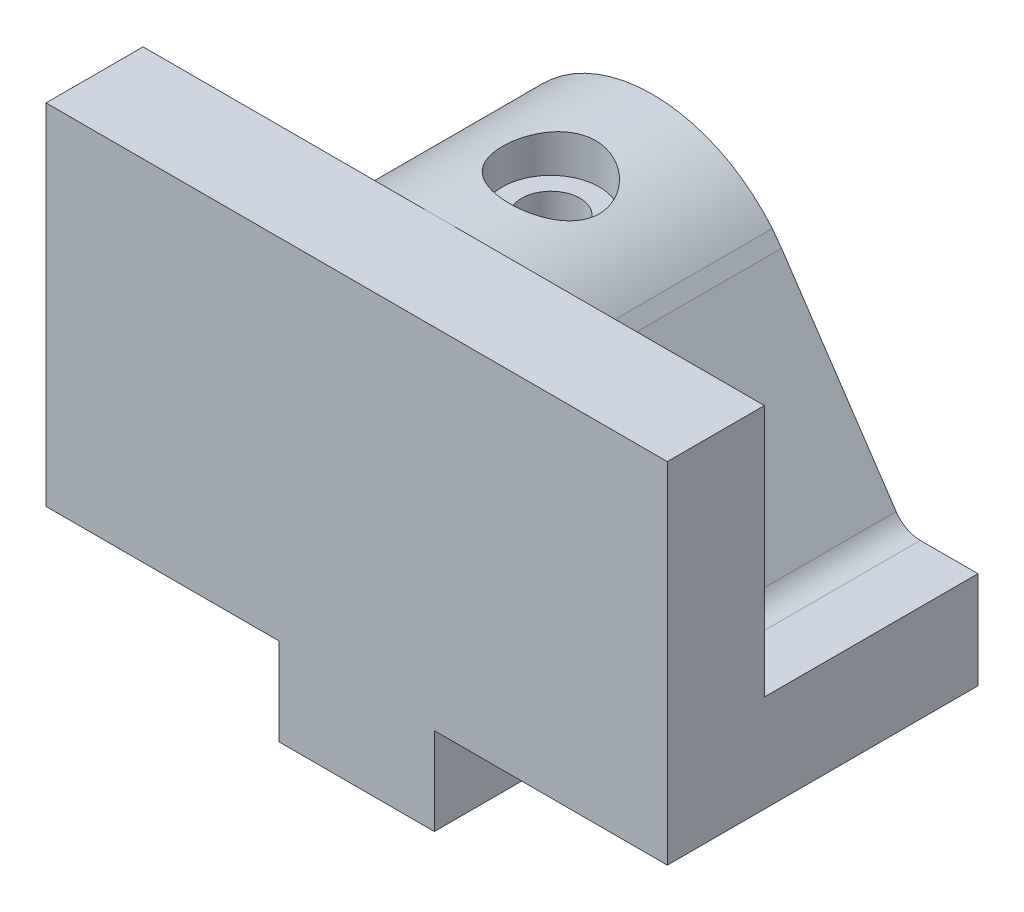
ISO-10303-21;
HEADER;
FILE_DESCRIPTION(('STEP AP214'),'2;1');
FILE_NAME('part.step','',(''),(''),'','','');
FILE_SCHEMA(('AUTOMOTIVE_DESIGN { 1 0 10303 214 1 1 1 1 }'));
ENDSEC;
DATA;
#1=APPLICATION_CONTEXT('core data for automotive mechanical design processes');
#2=APPLICATION_PROTOCOL_DEFINITION('international standard','automotive_design',2000,#1);
#3=PRODUCT_CONTEXT('',#1,'mechanical');
#4=PRODUCT('Part','Part','',(#3));
#5=PRODUCT_RELATED_PRODUCT_CATEGORY('part','',(#4));
#6=PRODUCT_DEFINITION_FORMATION('','',#4);
#7=PRODUCT_DEFINITION_CONTEXT('part definition',#1,'design');
#8=PRODUCT_DEFINITION('design','',#6,#7);
#9=PRODUCT_DEFINITION_SHAPE('','',#8);
#10=(LENGTH_UNIT() NAMED_UNIT(*) SI_UNIT(.MILLI.,.METRE.));
#11=(NAMED_UNIT(*) PLANE_ANGLE_UNIT() SI_UNIT($,.RADIAN.));
#12=(NAMED_UNIT(*) SI_UNIT($,.STERADIAN.) SOLID_ANGLE_UNIT());
#13=UNCERTAINTY_MEASURE_WITH_UNIT(LENGTH_MEASURE(1.E-05),#10,'distance_accuracy_value','');
#14=(GEOMETRIC_REPRESENTATION_CONTEXT(3) GLOBAL_UNCERTAINTY_ASSIGNED_CONTEXT((#13)) GLOBAL_UNIT_ASSIGNED_CONTEXT((#10,
#11,#12)) REPRESENTATION_CONTEXT('',''));
#15=CARTESIAN_POINT('',(0.,0.,0.));
#16=DIRECTION('',(0.,0.,1.));
#17=DIRECTION('',(1.,0.,0.));
#18=AXIS2_PLACEMENT_3D('',#15,#16,#17);
#19=CARTESIAN_POINT('',(33.5206158656522,-20.,11.));
#20=DIRECTION('',(0.,1.,0.));
#21=DIRECTION('',(-1.,0.,0.));
#22=AXIS2_PLACEMENT_3D('',#19,#20,#21);
#23=PLANE('',#22);
#24=DIRECTION('',(0.,0.,-1.));
#25=VECTOR('',#24,1.);
#26=CARTESIAN_POINT('',(-6.47938413434775,-20.,39.3575597506858));
#27=LINE('',#26,#25);
#28=CARTESIAN_POINT('',(-6.47938413434776,-20.,21.));
#29=VERTEX_POINT('',#28);
#30=CARTESIAN_POINT('',(-6.47938413434775,-20.,-11.));
#31=VERTEX_POINT('',#30);
#32=EDGE_CURVE('E68',#29,#31,#27,.T.);
#33=ORIENTED_EDGE('',*,*,#32,.F.);
#34=DIRECTION('',(1.,0.,0.));
#35=VECTOR('',#34,1.);
#36=CARTESIAN_POINT('',(-30.4793841343478,-20.,21.));
#37=LINE('',#36,#35);
#38=CARTESIAN_POINT('',(-30.4793841343478,-20.,21.));
#39=VERTEX_POINT('',#38);
#40=EDGE_CURVE('E272',#39,#29,#37,.T.);
#41=ORIENTED_EDGE('',*,*,#40,.F.);
#42=DIRECTION('',(0.,0.,-1.));
#43=VECTOR('',#42,1.);
#44=CARTESIAN_POINT('',(-30.4793841343478,-20.,11.));
#45=LINE('',#44,#43);
#46=CARTESIAN_POINT('',(-30.4793841343478,-20.,-11.));
#47=VERTEX_POINT('',#46);
#48=EDGE_CURVE('E53',#39,#47,#45,.T.);
#49=ORIENTED_EDGE('',*,*,#48,.T.);
#50=DIRECTION('',(1.,0.,0.));
#51=VECTOR('',#50,1.);
#52=CARTESIAN_POINT('',(33.5206158656522,-20.,-11.));
#53=LINE('',#52,#51);
#54=EDGE_CURVE('E216',#47,#31,#53,.T.);
#55=ORIENTED_EDGE('',*,*,#54,.T.);
#56=EDGE_LOOP('',(#33,#41,#49,#55));
#57=FACE_BOUND('',#56,.T.);
#58=ADVANCED_FACE('F41',(#57),#23,.F.);
#59=CARTESIAN_POINT('',(27.5790762015216,-7.,-11.));
#60=DIRECTION('',(0.,0.,1.));
#61=DIRECTION('',(1.,0.,0.));
#62=AXIS2_PLACEMENT_3D('',#59,#60,#61);
#63=PLANE('',#62);
#64=DIRECTION('',(0.,-1.,0.));
#65=VECTOR('',#64,1.);
#66=CARTESIAN_POINT('',(-30.4793841343478,-10.,-11.));
#67=LINE('',#66,#65);
#68=CARTESIAN_POINT('',(-30.4793841343478,-10.,-11.));
#69=VERTEX_POINT('',#68);
#70=EDGE_CURVE('E207',#69,#47,#67,.T.);
#71=ORIENTED_EDGE('',*,*,#70,.F.);
#72=DIRECTION('',(-1.,0.,0.));
#73=VECTOR('',#72,1.);
#74=CARTESIAN_POINT('',(-30.4793841343478,-10.,-11.));
#75=LINE('',#74,#73);
#76=CARTESIAN_POINT('',(-27.5790762015216,-10.,-11.));
#77=VERTEX_POINT('',#76);
#78=EDGE_CURVE('E242',#77,#69,#75,.T.);
#79=ORIENTED_EDGE('',*,*,#78,.F.);
#80=CARTESIAN_POINT('',(-27.5790762015216,-7.,-11.));
#81=DIRECTION('',(0.,0.,-1.));
#82=DIRECTION('',(-1.,0.,0.));
#83=AXIS2_PLACEMENT_3D('',#80,#81,#82);
#84=CIRCLE('',#83,3.);
#85=CARTESIAN_POINT('',(-25.0879938790146,-8.67167845666944,-11.));
#86=VERTEX_POINT('',#85);
#87=EDGE_CURVE('E240',#86,#77,#84,.T.);
#88=ORIENTED_EDGE('',*,*,#87,.F.);
#89=DIRECTION('',(-0.55722615222315,-0.830360774169025,0.));
#90=VECTOR('',#89,1.);
#91=CARTESIAN_POINT('',(-25.0879938790146,-8.67167845666944,-11.));
#92=LINE('',#91,#90);
#93=CARTESIAN_POINT('',(-13.2857723867044,8.9156184355704,-11.));
#94=VERTEX_POINT('',#93);
#95=EDGE_CURVE('E238',#94,#86,#92,.T.);
#96=ORIENTED_EDGE('',*,*,#95,.F.);
#97=CARTESIAN_POINT('',(0.,0.,-11.));
#98=DIRECTION('',(0.,0.,1.));
#99=DIRECTION('',(1.,0.,0.));
#100=AXIS2_PLACEMENT_3D('',#97,#98,#99);
#101=CIRCLE('',#100,16.);
#102=CARTESIAN_POINT('',(12.3334541959828,10.1924436518234,-11.));
#103=VERTEX_POINT('',#102);
#104=EDGE_CURVE('E236',#103,#94,#101,.T.);
#105=ORIENTED_EDGE('',*,*,#104,.F.);
#106=DIRECTION('',(-0.597868076572457,0.801594512840221,0.));
#107=VECTOR('',#106,1.);
#108=CARTESIAN_POINT('',(12.3334541959828,10.1924436518234,-11.));
#109=LINE('',#108,#107);
#110=CARTESIAN_POINT('',(13.2857723867044,8.9156184355704,-11.));
#111=VERTEX_POINT('',#110);
#112=EDGE_CURVE('E234',#111,#103,#109,.T.);
#113=ORIENTED_EDGE('',*,*,#112,.F.);
#114=DIRECTION('',(-0.55722615222315,0.830360774169025,0.));
#115=VECTOR('',#114,1.);
#116=CARTESIAN_POINT('',(25.0879938790146,-8.67167845666944,-11.));
#117=LINE('',#116,#115);
#118=CARTESIAN_POINT('',(25.0879938790146,-8.67167845666944,-11.));
#119=VERTEX_POINT('',#118);
#120=EDGE_CURVE('E232',#119,#111,#117,.T.);
#121=ORIENTED_EDGE('',*,*,#120,.F.);
#122=CARTESIAN_POINT('',(27.5790762015216,-7.,-11.));
#123=DIRECTION('',(0.,0.,-1.));
#124=DIRECTION('',(1.,0.,0.));
#125=AXIS2_PLACEMENT_3D('',#122,#123,#124);
#126=CIRCLE('',#125,3.);
#127=CARTESIAN_POINT('',(27.5790762015216,-10.,-11.));
#128=VERTEX_POINT('',#127);
#129=EDGE_CURVE('E230',#128,#119,#126,.T.);
#130=ORIENTED_EDGE('',*,*,#129,.F.);
#131=DIRECTION('',(-1.,0.,0.));
#132=VECTOR('',#131,1.);
#133=CARTESIAN_POINT('',(30.4793841343478,-10.,-11.));
#134=LINE('',#133,#132);
#135=CARTESIAN_POINT('',(33.5206158656522,-10.,-11.));
#136=VERTEX_POINT('',#135);
#137=EDGE_CURVE('E228',#136,#128,#134,.T.);
#138=ORIENTED_EDGE('',*,*,#137,.F.);
#139=DIRECTION('',(0.,1.,0.));
#140=VECTOR('',#139,1.);
#141=CARTESIAN_POINT('',(33.5206158656522,-10.,-11.));
#142=LINE('',#141,#140);
#143=CARTESIAN_POINT('',(33.5206158656522,-20.,-11.));
#144=VERTEX_POINT('',#143);
#145=EDGE_CURVE('E225',#144,#136,#142,.T.);
#146=ORIENTED_EDGE('',*,*,#145,.F.);
#147=CARTESIAN_POINT('',(9.52061586565225,-20.,-11.));
#148=VERTEX_POINT('',#147);
#149=EDGE_CURVE('E213',#148,#144,#53,.T.);
#150=ORIENTED_EDGE('',*,*,#149,.F.);
#151=DIRECTION('',(0.,-1.,0.));
#152=VECTOR('',#151,1.);
#153=CARTESIAN_POINT('',(9.52061586565225,-20.,-11.));
#154=LINE('',#153,#152);
#155=CARTESIAN_POINT('',(9.52061586565224,-29.,-11.));
#156=VERTEX_POINT('',#155);
#157=EDGE_CURVE('E400',#148,#156,#154,.T.);
#158=ORIENTED_EDGE('',*,*,#157,.T.);
#159=DIRECTION('',(-1.,0.,0.));
#160=VECTOR('',#159,1.);
#161=CARTESIAN_POINT('',(-6.47938413434775,-29.,-11.));
#162=LINE('',#161,#160);
#163=CARTESIAN_POINT('',(-6.47938413434775,-29.,-11.));
#164=VERTEX_POINT('',#163);
#165=EDGE_CURVE('E409',#156,#164,#162,.T.);
#166=ORIENTED_EDGE('',*,*,#165,.T.);
#167=DIRECTION('',(0.,1.,0.));
#168=VECTOR('',#167,1.);
#169=CARTESIAN_POINT('',(-6.47938413434775,-20.,-11.));
#170=LINE('',#169,#168);
#171=EDGE_CURVE('E412',#164,#31,#170,.T.);
#172=ORIENTED_EDGE('',*,*,#171,.T.);
#173=ORIENTED_EDGE('',*,*,#54,.F.);
#174=EDGE_LOOP('',(#71,#79,#88,#96,#105,#113,#121,#130,#138,#146,#150,#158,#166,#172,#173));
#175=FACE_BOUND('',#174,.T.);
#176=CARTESIAN_POINT('',(0.,0.,-11.));
#177=DIRECTION('',(0.,0.,1.));
#178=DIRECTION('',(1.,0.,0.));
#179=AXIS2_PLACEMENT_3D('',#176,#177,#178);
#180=CIRCLE('',#179,6.);
#181=CARTESIAN_POINT('',(6.,0.,-11.));
#182=VERTEX_POINT('',#181);
#183=EDGE_CURVE('E214',#182,#182,#180,.T.);
#184=ORIENTED_EDGE('',*,*,#183,.T.);
#185=EDGE_LOOP('',(#184));
#186=FACE_BOUND('',#185,.T.);
#187=ADVANCED_FACE('F185',(#175,#186),#63,.F.);
#188=CARTESIAN_POINT('',(-30.4793841343478,-10.,11.));
#189=DIRECTION('',(1.,0.,0.));
#190=DIRECTION('',(0.,0.,-1.));
#191=AXIS2_PLACEMENT_3D('',#188,#189,#190);
#192=PLANE('',#191);
#193=ORIENTED_EDGE('',*,*,#70,.T.);
#194=ORIENTED_EDGE('',*,*,#48,.F.);
#195=DIRECTION('',(0.,-1.,0.));
#196=VECTOR('',#195,1.);
#197=CARTESIAN_POINT('',(-30.4793841343478,-20.,21.));
#198=LINE('',#197,#196);
#199=CARTESIAN_POINT('',(-30.4793841343478,16.,21.));
#200=VERTEX_POINT('',#199);
#201=EDGE_CURVE('E278',#200,#39,#198,.T.);
#202=ORIENTED_EDGE('',*,*,#201,.F.);
#203=DIRECTION('',(0.,0.,-1.));
#204=VECTOR('',#203,1.);
#205=CARTESIAN_POINT('',(-30.4793841343478,16.,21.));
#206=LINE('',#205,#204);
#207=CARTESIAN_POINT('',(-30.4793841343478,16.,11.));
#208=VERTEX_POINT('',#207);
#209=EDGE_CURVE('E295',#200,#208,#206,.T.);
#210=ORIENTED_EDGE('',*,*,#209,.T.);
#211=DIRECTION('',(0.,-1.,0.));
#212=VECTOR('',#211,1.);
#213=CARTESIAN_POINT('',(-30.4793841343478,-20.,11.));
#214=LINE('',#213,#212);
#215=CARTESIAN_POINT('',(-30.4793841343478,-10.,11.));
#216=VERTEX_POINT('',#215);
#217=EDGE_CURVE('E296',#208,#216,#214,.T.);
#218=ORIENTED_EDGE('',*,*,#217,.T.);
#219=DIRECTION('',(0.,0.,-1.));
#220=VECTOR('',#219,1.);
#221=CARTESIAN_POINT('',(-30.4793841343478,-10.,11.));
#222=LINE('',#221,#220);
#223=EDGE_CURVE('E211',#216,#69,#222,.T.);
#224=ORIENTED_EDGE('',*,*,#223,.T.);
#225=EDGE_LOOP('',(#193,#194,#202,#210,#218,#224));
#226=FACE_BOUND('',#225,.T.);
#227=ADVANCED_FACE('F43',(#226),#192,.F.);
#228=CARTESIAN_POINT('',(9.52061586565224,-20.,21.));
#229=VERTEX_POINT('',#228);
#230=CARTESIAN_POINT('',(33.5206158656522,-20.,21.));
#231=VERTEX_POINT('',#230);
#232=EDGE_CURVE('E60',#229,#231,#37,.T.);
#233=ORIENTED_EDGE('',*,*,#232,.F.);
#234=DIRECTION('',(0.,0.,-1.));
#235=VECTOR('',#234,1.);
#236=CARTESIAN_POINT('',(9.52061586565225,-20.,39.3575597506858));
#237=LINE('',#236,#235);
#238=EDGE_CURVE('E405',#229,#148,#237,.T.);
#239=ORIENTED_EDGE('',*,*,#238,.T.);
#240=ORIENTED_EDGE('',*,*,#149,.T.);
#241=DIRECTION('',(0.,0.,-1.));
#242=VECTOR('',#241,1.);
#243=CARTESIAN_POINT('',(33.5206158656522,-20.,11.));
#244=LINE('',#243,#242);
#245=EDGE_CURVE('E270',#231,#144,#244,.T.);
#246=ORIENTED_EDGE('',*,*,#245,.F.);
#247=EDGE_LOOP('',(#233,#239,#240,#246));
#248=FACE_BOUND('',#247,.T.);
#249=ADVANCED_FACE('F186',(#248),#23,.F.);
#250=CARTESIAN_POINT('',(33.5206158656522,-10.,11.));
#251=DIRECTION('',(-1.,0.,0.));
#252=DIRECTION('',(0.,0.,1.));
#253=AXIS2_PLACEMENT_3D('',#250,#251,#252);
#254=PLANE('',#253);
#255=ORIENTED_EDGE('',*,*,#145,.T.);
#256=DIRECTION('',(0.,0.,-1.));
#257=VECTOR('',#256,1.);
#258=CARTESIAN_POINT('',(33.5206158656522,-10.,11.));
#259=LINE('',#258,#257);
#260=CARTESIAN_POINT('',(33.5206158656522,-10.,11.));
#261=VERTEX_POINT('',#260);
#262=EDGE_CURVE('E267',#261,#136,#259,.T.);
#263=ORIENTED_EDGE('',*,*,#262,.F.);
#264=DIRECTION('',(0.,1.,0.));
#265=VECTOR('',#264,1.);
#266=CARTESIAN_POINT('',(33.5206158656522,-20.,11.));
#267=LINE('',#266,#265);
#268=CARTESIAN_POINT('',(33.5206158656522,16.,11.));
#269=VERTEX_POINT('',#268);
#270=EDGE_CURVE('E298',#261,#269,#267,.T.);
#271=ORIENTED_EDGE('',*,*,#270,.T.);
#272=DIRECTION('',(0.,0.,-1.));
#273=VECTOR('',#272,1.);
#274=CARTESIAN_POINT('',(33.5206158656522,16.,21.));
#275=LINE('',#274,#273);
#276=CARTESIAN_POINT('',(33.5206158656522,16.,21.));
#277=VERTEX_POINT('',#276);
#278=EDGE_CURVE('E301',#277,#269,#275,.T.);
#279=ORIENTED_EDGE('',*,*,#278,.F.);
#280=DIRECTION('',(0.,1.,0.));
#281=VECTOR('',#280,1.);
#282=CARTESIAN_POINT('',(33.5206158656522,-20.,21.));
#283=LINE('',#282,#281);
#284=EDGE_CURVE('E276',#231,#277,#283,.T.);
#285=ORIENTED_EDGE('',*,*,#284,.F.);
#286=ORIENTED_EDGE('',*,*,#245,.T.);
#287=EDGE_LOOP('',(#255,#263,#271,#279,#285,#286));
#288=FACE_BOUND('',#287,.T.);
#289=ADVANCED_FACE('F194',(#288),#254,.F.);
#290=CARTESIAN_POINT('',(30.4793841343478,-10.,11.));
#291=DIRECTION('',(0.,-1.,0.));
#292=DIRECTION('',(0.,0.,-1.));
#293=AXIS2_PLACEMENT_3D('',#290,#291,#292);
#294=PLANE('',#293);
#295=ORIENTED_EDGE('',*,*,#137,.T.);
#296=DIRECTION('',(0.,0.,-1.));
#297=VECTOR('',#296,1.);
#298=CARTESIAN_POINT('',(27.5790762015216,-10.,11.));
#299=LINE('',#298,#297);
#300=CARTESIAN_POINT('',(27.5790762015216,-10.,11.));
#301=VERTEX_POINT('',#300);
#302=EDGE_CURVE('E264',#301,#128,#299,.T.);
#303=ORIENTED_EDGE('',*,*,#302,.F.);
#304=DIRECTION('',(-1.,0.,0.));
#305=VECTOR('',#304,1.);
#306=CARTESIAN_POINT('',(31.0759594186976,-10.,11.));
#307=LINE('',#306,#305);
#308=EDGE_CURVE('E244',#261,#301,#307,.T.);
#309=ORIENTED_EDGE('',*,*,#308,.F.);
#310=ORIENTED_EDGE('',*,*,#262,.T.);
#311=EDGE_LOOP('',(#295,#303,#309,#310));
#312=FACE_BOUND('',#311,.T.);
#313=ADVANCED_FACE('F199',(#312),#294,.F.);
#314=CARTESIAN_POINT('',(27.5790762015216,-7.,11.));
#315=DIRECTION('',(0.,0.,-1.));
#316=DIRECTION('',(-1.,0.,0.));
#317=AXIS2_PLACEMENT_3D('',#314,#315,#316);
#318=CYLINDRICAL_SURFACE('',#317,3.);
#319=ORIENTED_EDGE('',*,*,#129,.T.);
#320=DIRECTION('',(0.,0.,-1.));
#321=VECTOR('',#320,1.);
#322=CARTESIAN_POINT('',(25.0879938790146,-8.67167845666944,11.));
#323=LINE('',#322,#321);
#324=CARTESIAN_POINT('',(25.0879938790146,-8.67167845666944,11.));
#325=VERTEX_POINT('',#324);
#326=EDGE_CURVE('E261',#325,#119,#323,.T.);
#327=ORIENTED_EDGE('',*,*,#326,.F.);
#328=CARTESIAN_POINT('',(27.5790762015216,-7.,11.));
#329=DIRECTION('',(0.,0.,-1.));
#330=DIRECTION('',(1.,0.,0.));
#331=AXIS2_PLACEMENT_3D('',#328,#329,#330);
#332=CIRCLE('',#331,3.);
#333=EDGE_CURVE('E308',#301,#325,#332,.T.);
#334=ORIENTED_EDGE('',*,*,#333,.F.);
#335=ORIENTED_EDGE('',*,*,#302,.T.);
#336=EDGE_LOOP('',(#319,#327,#334,#335));
#337=FACE_BOUND('',#336,.T.);
#338=ADVANCED_FACE('F381',(#337),#318,.F.);
#339=CARTESIAN_POINT('',(25.0879938790146,-8.67167845666944,11.));
#340=DIRECTION('',(-0.830360774169026,-0.55722615222315,0.));
#341=DIRECTION('',(0.55722615222315,-0.830360774169025,0.));
#342=AXIS2_PLACEMENT_3D('',#339,#340,#341);
#343=PLANE('',#342);
#344=ORIENTED_EDGE('',*,*,#120,.T.);
#345=DIRECTION('',(0.,0.,-1.));
#346=VECTOR('',#345,1.);
#347=CARTESIAN_POINT('',(13.2857723867044,8.9156184355704,11.));
#348=LINE('',#347,#346);
#349=CARTESIAN_POINT('',(13.2857723867044,8.9156184355704,11.));
#350=VERTEX_POINT('',#349);
#351=EDGE_CURVE('E258',#350,#111,#348,.T.);
#352=ORIENTED_EDGE('',*,*,#351,.F.);
#353=DIRECTION('',(-0.55722615222315,0.830360774169025,0.));
#354=VECTOR('',#353,1.);
#355=CARTESIAN_POINT('',(25.0879938790146,-8.67167845666944,11.));
#356=LINE('',#355,#354);
#357=EDGE_CURVE('E311',#325,#350,#356,.T.);
#358=ORIENTED_EDGE('',*,*,#357,.F.);
#359=ORIENTED_EDGE('',*,*,#326,.T.);
#360=EDGE_LOOP('',(#344,#352,#358,#359));
#361=FACE_BOUND('',#360,.T.);
#362=ADVANCED_FACE('F378',(#361),#343,.F.);
#363=CARTESIAN_POINT('',(12.3334541959828,10.1924436518234,11.));
#364=DIRECTION('',(-0.801594512840221,-0.597868076572457,0.));
#365=DIRECTION('',(0.597868076572457,-0.801594512840221,0.));
#366=AXIS2_PLACEMENT_3D('',#363,#364,#365);
#367=PLANE('',#366);
#368=ORIENTED_EDGE('',*,*,#112,.T.);
#369=DIRECTION('',(0.,0.,-1.));
#370=VECTOR('',#369,1.);
#371=CARTESIAN_POINT('',(12.3334541959828,10.1924436518234,11.));
#372=LINE('',#371,#370);
#373=CARTESIAN_POINT('',(12.3334541959828,10.1924436518234,11.));
#374=VERTEX_POINT('',#373);
#375=EDGE_CURVE('E255',#374,#103,#372,.T.);
#376=ORIENTED_EDGE('',*,*,#375,.F.);
#377=DIRECTION('',(-0.597868076572457,0.801594512840221,0.));
#378=VECTOR('',#377,1.);
#379=CARTESIAN_POINT('',(12.3334541959828,10.1924436518234,11.));
#380=LINE('',#379,#378);
#381=EDGE_CURVE('E314',#350,#374,#380,.T.);
#382=ORIENTED_EDGE('',*,*,#381,.F.);
#383=ORIENTED_EDGE('',*,*,#351,.T.);
#384=EDGE_LOOP('',(#368,#376,#382,#383));
#385=FACE_BOUND('',#384,.T.);
#386=ADVANCED_FACE('F347',(#385),#367,.F.);
#387=CARTESIAN_POINT('',(0.,0.,11.));
#388=DIRECTION('',(0.,0.,-1.));
#389=DIRECTION('',(-1.,0.,0.));
#390=AXIS2_PLACEMENT_3D('',#387,#388,#389);
#391=CYLINDRICAL_SURFACE('',#390,16.);
#392=CARTESIAN_POINT('',(1.52061586564812,15.9275775744191,6.00000000000239));
#393=CARTESIAN_POINT('',(1.25080409893954,15.9533386544381,6.00000215922781));
#394=CARTESIAN_POINT('',(0.980341520222215,15.9721780463744,5.97809498009837));
#395=CARTESIAN_POINT('',(0.445944758091531,15.9960203304318,5.89064106795977));
#396=CARTESIAN_POINT('',(0.182010201775843,16.0010240147121,5.82509683364318));
#397=CARTESIAN_POINT('',(-0.331494099115679,15.9986268349223,5.65220941784981));
#398=CARTESIAN_POINT('',(-0.581073514489752,15.9912344255579,5.54489476404721));
#399=CARTESIAN_POINT('',(-1.05923110721398,15.966697309782,5.29157610306704));
#400=CARTESIAN_POINT('',(-1.28780571064235,15.9495509473128,5.14556552821946));
#401=CARTESIAN_POINT('',(-1.72126420202845,15.9086585252278,4.81646100975705));
#402=CARTESIAN_POINT('',(-1.92574139613363,15.8848173472436,4.6328437709435));
#403=CARTESIAN_POINT('',(-2.3018064521942,15.8347009218671,4.23482274906393));
#404=CARTESIAN_POINT('',(-2.47338932454231,15.8084253060999,4.02041430401757));
#405=CARTESIAN_POINT('',(-2.7836443832459,15.7568027210531,3.55980523155758));
#406=CARTESIAN_POINT('',(-2.92124188654655,15.7315034106028,3.31287389144397));
#407=CARTESIAN_POINT('',(-3.15306505994951,15.6866886953029,2.79893284233273));
#408=CARTESIAN_POINT('',(-3.24729366245062,15.6671728994312,2.53192449226768));
#409=CARTESIAN_POINT('',(-3.38902873707301,15.6371275162567,1.98699375095114));
#410=CARTESIAN_POINT('',(-3.43681346254041,15.6265444622599,1.70914686302163));
#411=CARTESIAN_POINT('',(-3.4850493166008,15.6158596651074,1.14919326882268));
#412=CARTESIAN_POINT('',(-3.48550717371301,15.6157564320227,0.867087173793733));
#413=CARTESIAN_POINT('',(-3.43958336899392,15.6259324319677,0.312879948423317));
#414=CARTESIAN_POINT('',(-3.39418029329756,15.6359947519732,0.0406929349866337));
#415=CARTESIAN_POINT('',(-3.25945993097575,15.6646293913009,-0.492112476217678));
#416=CARTESIAN_POINT('',(-3.17013935793354,15.6832023474806,-0.752730006630807));
#417=CARTESIAN_POINT('',(-2.94944556223034,15.7262019773418,-1.25718798072228));
#418=CARTESIAN_POINT('',(-2.81777729525255,15.7506694095339,-1.50089568055881));
#419=CARTESIAN_POINT('',(-2.51619723751303,15.8016477111798,-1.96316142387802));
#420=CARTESIAN_POINT('',(-2.34627955597153,15.8281588949771,-2.18171558562877));
#421=CARTESIAN_POINT('',(-1.96863037154749,15.8795935445512,-2.59229454997224));
#422=CARTESIAN_POINT('',(-1.76017494813491,15.9044715563388,-2.78366029826376));
#423=CARTESIAN_POINT('',(-1.31355489134801,15.9475642485136,-3.12881371376564));
#424=CARTESIAN_POINT('',(-1.0753925528556,15.9657794431815,-3.28260428097514));
#425=CARTESIAN_POINT('',(-0.578425890769599,15.9914559152139,-3.54669418970671));
#426=CARTESIAN_POINT('',(-0.31984110561534,15.9990185147067,-3.65739595109008));
#427=CARTESIAN_POINT('',(0.212242897381335,16.0008005896267,-3.83390901887536));
#428=CARTESIAN_POINT('',(0.485738298938188,15.9950234637704,-3.89973175409229));
#429=CARTESIAN_POINT('',(1.0302741798332,15.9690467345561,-3.98327311462046));
#430=CARTESIAN_POINT('',(1.3011119232033,15.949315777637,-4.00246726282362));
#431=CARTESIAN_POINT('',(1.84095313872518,15.8960516585635,-3.99702435630354));
#432=CARTESIAN_POINT('',(2.1099566276456,15.8625186227594,-3.97238770281961));
#433=CARTESIAN_POINT('',(2.63841969533129,15.7832223586012,-3.88081773293638));
#434=CARTESIAN_POINT('',(2.89788959594004,15.7374728289847,-3.81393167810287));
#435=CARTESIAN_POINT('',(3.40123127029402,15.6364188063746,-3.64049365606722));
#436=CARTESIAN_POINT('',(3.64509956919696,15.5811121948766,-3.53393288816931));
#437=CARTESIAN_POINT('',(4.12255267290489,15.461821066669,-3.27862076612968));
#438=CARTESIAN_POINT('',(4.35514599583461,15.3975541305122,-3.12815173821548));
#439=CARTESIAN_POINT('',(4.7922337188278,15.2671722563305,-2.79112580237071));
#440=CARTESIAN_POINT('',(4.99671738520336,15.2010566239128,-2.60455517413464));
#441=CARTESIAN_POINT('',(5.28268291597328,15.1031149010443,-2.29661891804301));
#442=CARTESIAN_POINT('',(5.37627189133072,15.0699914076267,-2.18666138458936));
#443=CARTESIAN_POINT('',(5.55379941373093,15.0054726998822,-1.9587605048922));
#444=CARTESIAN_POINT('',(5.63774166673653,14.9740768242918,-1.84082025320941));
#445=CARTESIAN_POINT('',(5.79535962268099,14.9137835024888,-1.59761015699272));
#446=CARTESIAN_POINT('',(5.86903190734449,14.8848868893442,-1.47233789166272));
#447=CARTESIAN_POINT('',(6.00541233551513,14.8303882048846,-1.21534348993016));
#448=CARTESIAN_POINT('',(6.06812571036985,14.8047845631854,-1.08362446960383));
#449=CARTESIAN_POINT('',(6.18047311069517,14.7582299904034,-0.818222118541029));
#450=CARTESIAN_POINT('',(6.2304144646887,14.7371721335299,-0.684687757598967));
#451=CARTESIAN_POINT('',(6.31882948167439,14.6994797884771,-0.41332833746474));
#452=CARTESIAN_POINT('',(6.35730845509486,14.6828432523221,-0.275505297972406));
#453=CARTESIAN_POINT('',(6.42237227115208,14.654500876505,0.00336727928502915));
#454=CARTESIAN_POINT('',(6.44896158503948,14.6427931833888,0.144415583139606));
#455=CARTESIAN_POINT('',(6.48993343951408,14.6246801538818,0.428608126242881));
#456=CARTESIAN_POINT('',(6.50431692178261,14.6182744084461,0.571752202935523));
#457=CARTESIAN_POINT('',(6.52003625216029,14.6112693052229,0.847370599659839));
#458=CARTESIAN_POINT('',(6.52232527960831,14.6102458000901,0.979780755550184));
#459=CARTESIAN_POINT('',(6.51639407180342,14.6128922531957,1.24436492574753));
#460=CARTESIAN_POINT('',(6.50817036078176,14.6165637637214,1.37653884747857));
#461=CARTESIAN_POINT('',(6.48130531985723,14.6284960164109,1.63955284474279));
#462=CARTESIAN_POINT('',(6.46266853565302,14.6367547560671,1.77039347694723));
#463=CARTESIAN_POINT('',(6.41517567797062,14.6576325632449,2.02989952057014));
#464=CARTESIAN_POINT('',(6.38631572619143,14.6702532855011,2.15856408703239));
#465=CARTESIAN_POINT('',(6.31945760623385,14.6991751197717,2.40982942259379));
#466=CARTESIAN_POINT('',(6.28168774344126,14.7153837422054,2.53250162553576));
#467=CARTESIAN_POINT('',(6.19702373776668,14.7512373699387,2.77415468941358));
#468=CARTESIAN_POINT('',(6.15012638922078,14.7708835823086,2.89313423637998));
#469=CARTESIAN_POINT('',(5.9963141615612,14.834303393544,3.24344833651951));
#470=CARTESIAN_POINT('',(5.87622974693863,14.8825803279432,3.46834199405947));
#471=CARTESIAN_POINT('',(5.59575494252573,14.9903780773057,3.90963899845201));
#472=CARTESIAN_POINT('',(5.43327580604684,15.0504209674663,4.12457626045596));
#473=CARTESIAN_POINT('',(5.0766429934924,15.174429847849,4.52513903306805));
#474=CARTESIAN_POINT('',(4.88247609365496,15.2383974689332,4.7107522424075));
#475=CARTESIAN_POINT('',(4.45262510321782,15.3697075262141,5.06018946253449));
#476=CARTESIAN_POINT('',(4.21501795744932,15.4369844661234,5.22168062986495));
#477=CARTESIAN_POINT('',(3.71432005613623,15.5650412529376,5.5022185546935));
#478=CARTESIAN_POINT('',(3.45123167948737,15.6258217052343,5.62126926953107));
#479=CARTESIAN_POINT('',(2.91487030495273,15.7345485568565,5.80981338663384));
#480=CARTESIAN_POINT('',(2.6421708852927,15.7828361164073,5.88073664054099));
#481=CARTESIAN_POINT('',(2.08675608729136,15.8658170903302,5.97581878432497));
#482=CARTESIAN_POINT('',(1.80404505790224,15.9005163302398,5.99999773180065));
#483=CARTESIAN_POINT('',(1.52061586564812,15.9275775744191,6.00000000000239));
#484=B_SPLINE_CURVE_WITH_KNOTS('',3,(#392,#393,#394,#395,#396,#397,#398,#399,#400,#401,#402,
#403,#404,#405,#406,#407,#408,#409,#410,#411,#412,#413,#414,#415,#416,#417,#418,#419,#420,#421,
#422,#423,#424,#425,#426,#427,#428,#429,#430,#431,#432,#433,#434,#435,#436,#437,#438,#439,#440,
#441,#442,#443,#444,#445,#446,#447,#448,#449,#450,#451,#452,#453,#454,#455,#456,#457,#458,#459,
#460,#461,#462,#463,#464,#465,#466,#467,#468,#469,#470,#471,#472,#473,#474,#475,#476,#477,#478,
#479,#480,#481,#482,#483),.UNSPECIFIED.,.T.,.F.,(4,2,2,2,2,2,2,2,2,2,2,2,2,2,2,2,2,2,2,2,2,2,2,
2,2,2,2,2,2,2,2,2,2,2,2,2,2,2,2,2,2,2,2,2,2,4),(0.,0.812112682899072,1.6241788675773,
2.43569141104961,3.24734177689529,4.07116434308421,4.89511177290034,5.74249074510098,
6.58981241314544,7.43202575129626,8.27411935077395,9.0986160683842,9.92317449379864,
10.7536069598597,11.5841674081594,12.4322987175774,13.2803645487333,14.1203082463727,
14.9600379654348,15.7728275675233,16.5856097291487,17.3974842922471,18.209539053802,
19.0590082592699,19.9088009393078,20.3527859268325,20.7965997752486,21.2405609925761,
21.6843096980792,22.1160815768409,22.5476531069536,22.9790622025845,23.410438011927,
23.8072466288043,24.2041864742647,24.6009531757614,24.997870557714,25.3855504743595,
25.7733667945557,26.5484316230889,27.3731326239616,28.1981786686955,29.0792032654212,
29.9601456899335,30.8136120740175,31.6667121613166),.UNSPECIFIED.);
#485=CARTESIAN_POINT('',(1.52061586564812,15.9275775744191,6.00000000000239));
#486=VERTEX_POINT('',#485);
#487=EDGE_CURVE('E11',#486,#486,#484,.T.);
#488=ORIENTED_EDGE('',*,*,#487,.T.);
#489=EDGE_LOOP('',(#488));
#490=FACE_BOUND('',#489,.T.);
#491=ORIENTED_EDGE('',*,*,#104,.T.);
#492=DIRECTION('',(0.,0.,-1.));
#493=VECTOR('',#492,1.);
#494=CARTESIAN_POINT('',(-13.2857723867044,8.9156184355704,11.));
#495=LINE('',#494,#493);
#496=CARTESIAN_POINT('',(-13.2857723867044,8.9156184355704,11.));
#497=VERTEX_POINT('',#496);
#498=EDGE_CURVE('E252',#497,#94,#495,.T.);
#499=ORIENTED_EDGE('',*,*,#498,.F.);
#500=CARTESIAN_POINT('',(0.,0.,11.));
#501=DIRECTION('',(0.,0.,1.));
#502=DIRECTION('',(1.,0.,0.));
#503=AXIS2_PLACEMENT_3D('',#500,#501,#502);
#504=CIRCLE('',#503,16.);
#505=CARTESIAN_POINT('',(0.,16.,11.));
#506=VERTEX_POINT('',#505);
#507=EDGE_CURVE('E317',#506,#497,#504,.T.);
#508=ORIENTED_EDGE('',*,*,#507,.F.);
#509=EDGE_CURVE('E318',#374,#506,#504,.T.);
#510=ORIENTED_EDGE('',*,*,#509,.F.);
#511=ORIENTED_EDGE('',*,*,#375,.T.);
#512=EDGE_LOOP('',(#491,#499,#508,#510,#511));
#513=FACE_BOUND('',#512,.T.);
#514=ADVANCED_FACE('F340',(#490,#513),#391,.T.);
#515=CARTESIAN_POINT('',(-25.0879938790146,-8.67167845666944,11.));
#516=DIRECTION('',(0.830360774169026,-0.55722615222315,0.));
#517=DIRECTION('',(0.55722615222315,0.830360774169025,0.));
#518=AXIS2_PLACEMENT_3D('',#515,#516,#517);
#519=PLANE('',#518);
#520=ORIENTED_EDGE('',*,*,#95,.T.);
#521=DIRECTION('',(0.,0.,-1.));
#522=VECTOR('',#521,1.);
#523=CARTESIAN_POINT('',(-25.0879938790146,-8.67167845666944,11.));
#524=LINE('',#523,#522);
#525=CARTESIAN_POINT('',(-25.0879938790146,-8.67167845666944,11.));
#526=VERTEX_POINT('',#525);
#527=EDGE_CURVE('E249',#526,#86,#524,.T.);
#528=ORIENTED_EDGE('',*,*,#527,.F.);
#529=DIRECTION('',(-0.55722615222315,-0.830360774169025,0.));
#530=VECTOR('',#529,1.);
#531=CARTESIAN_POINT('',(-25.0879938790146,-8.67167845666944,11.));
#532=LINE('',#531,#530);
#533=EDGE_CURVE('E321',#497,#526,#532,.T.);
#534=ORIENTED_EDGE('',*,*,#533,.F.);
#535=ORIENTED_EDGE('',*,*,#498,.T.);
#536=EDGE_LOOP('',(#520,#528,#534,#535));
#537=FACE_BOUND('',#536,.T.);
#538=ADVANCED_FACE('F355',(#537),#519,.F.);
#539=CARTESIAN_POINT('',(-27.5790762015216,-7.,11.));
#540=DIRECTION('',(0.,0.,-1.));
#541=DIRECTION('',(-1.,0.,0.));
#542=AXIS2_PLACEMENT_3D('',#539,#540,#541);
#543=CYLINDRICAL_SURFACE('',#542,3.);
#544=ORIENTED_EDGE('',*,*,#87,.T.);
#545=DIRECTION('',(0.,0.,-1.));
#546=VECTOR('',#545,1.);
#547=CARTESIAN_POINT('',(-27.5790762015216,-10.,11.));
#548=LINE('',#547,#546);
#549=CARTESIAN_POINT('',(-27.5790762015216,-10.,11.));
#550=VERTEX_POINT('',#549);
#551=EDGE_CURVE('E246',#550,#77,#548,.T.);
#552=ORIENTED_EDGE('',*,*,#551,.F.);
#553=CARTESIAN_POINT('',(-27.5790762015216,-7.,11.));
#554=DIRECTION('',(0.,0.,-1.));
#555=DIRECTION('',(-1.,0.,0.));
#556=AXIS2_PLACEMENT_3D('',#553,#554,#555);
#557=CIRCLE('',#556,3.);
#558=EDGE_CURVE('E323',#526,#550,#557,.T.);
#559=ORIENTED_EDGE('',*,*,#558,.F.);
#560=ORIENTED_EDGE('',*,*,#527,.T.);
#561=EDGE_LOOP('',(#544,#552,#559,#560));
#562=FACE_BOUND('',#561,.T.);
#563=ADVANCED_FACE('F357',(#562),#543,.F.);
#564=CARTESIAN_POINT('',(-30.4793841343478,-10.,11.));
#565=DIRECTION('',(0.,-1.,0.));
#566=DIRECTION('',(0.,0.,-1.));
#567=AXIS2_PLACEMENT_3D('',#564,#565,#566);
#568=PLANE('',#567);
#569=ORIENTED_EDGE('',*,*,#78,.T.);
#570=ORIENTED_EDGE('',*,*,#223,.F.);
#571=DIRECTION('',(-1.,0.,0.));
#572=VECTOR('',#571,1.);
#573=CARTESIAN_POINT('',(-30.4793841343478,-10.,11.));
#574=LINE('',#573,#572);
#575=EDGE_CURVE('E222',#550,#216,#574,.T.);
#576=ORIENTED_EDGE('',*,*,#575,.F.);
#577=ORIENTED_EDGE('',*,*,#551,.T.);
#578=EDGE_LOOP('',(#569,#570,#576,#577));
#579=FACE_BOUND('',#578,.T.);
#580=ADVANCED_FACE('F358',(#579),#568,.F.);
#581=CARTESIAN_POINT('',(0.,0.,11.));
#582=DIRECTION('',(0.,0.,-1.));
#583=DIRECTION('',(-1.,0.,0.));
#584=AXIS2_PLACEMENT_3D('',#581,#582,#583);
#585=CYLINDRICAL_SURFACE('',#584,6.);
#586=CARTESIAN_POINT('',(1.52061586564812,5.80411297177607,4.00000000000239));
#587=CARTESIAN_POINT('',(1.3709487497871,5.84331632202069,3.99999136769845));
#588=CARTESIAN_POINT('',(1.21962485572977,5.87672683151945,3.98874703771768));
#589=CARTESIAN_POINT('',(0.918392071051923,5.93127399853484,3.94288031169323));
#590=CARTESIAN_POINT('',(0.768482717842993,5.95241481577859,3.90826584731896));
#591=CARTESIAN_POINT('',(0.474683850399087,5.98301717824831,3.81597747987719));
#592=CARTESIAN_POINT('',(0.330794584153935,5.99247824279848,3.75830262789747));
#593=CARTESIAN_POINT('',(0.0533925441761501,6.00137019276129,3.6212990291784));
#594=CARTESIAN_POINT('',(-0.0801172482911739,6.00079820702354,3.54196409038264));
#595=CARTESIAN_POINT('',(-0.334047409462295,5.99205253197794,3.36315947753691));
#596=CARTESIAN_POINT('',(-0.454363564755405,5.9838226008833,3.26354509963289));
#597=CARTESIAN_POINT('',(-0.677904254855067,5.96264003871546,3.04712787671806));
#598=CARTESIAN_POINT('',(-0.781123847330236,5.94968604544761,2.93032007974337));
#599=CARTESIAN_POINT('',(-0.974190359250456,5.92124110311836,2.67429436727079));
#600=CARTESIAN_POINT('',(-1.06275466326554,5.90564071733912,2.53411953640739));
#601=CARTESIAN_POINT('',(-1.21568620200061,5.8760699918723,2.24096306893347));
#602=CARTESIAN_POINT('',(-1.28005088166079,5.86209982441477,2.08798008208803));
#603=CARTESIAN_POINT('',(-1.38391614159813,5.8384677860246,1.7696313094056));
#604=CARTESIAN_POINT('',(-1.42283066206954,5.82890886309232,1.6040655477954));
#605=CARTESIAN_POINT('',(-1.47214954845575,5.81665207534641,1.26850982857739));
#606=CARTESIAN_POINT('',(-1.48256084722593,5.81395254213086,1.09852095696182));
#607=CARTESIAN_POINT('',(-1.47463724886434,5.81596492158297,0.764137800661067));
#608=CARTESIAN_POINT('',(-1.45711446871102,5.82046746381089,0.599722334176347));
#609=CARTESIAN_POINT('',(-1.39542866941462,5.83556091817416,0.276259076099296));
#610=CARTESIAN_POINT('',(-1.35126272387633,5.84615249910292,0.117211876165844));
#611=CARTESIAN_POINT('',(-1.23754590548727,5.87127340429615,-0.191493836610441));
#612=CARTESIAN_POINT('',(-1.16795034929449,5.88580964823829,-0.341135276432517));
#613=CARTESIAN_POINT('',(-1.00525034643845,5.91576646373316,-0.626977670946199));
#614=CARTESIAN_POINT('',(-0.912140019218153,5.93118725574638,-0.76317525173974));
#615=CARTESIAN_POINT('',(-0.701736413236131,5.9597929553954,-1.02232200496327));
#616=CARTESIAN_POINT('',(-0.583829614657328,5.97290162558645,-1.14478304411075));
#617=CARTESIAN_POINT('',(-0.328705368608482,5.99235139873082,-1.36827897385171));
#618=CARTESIAN_POINT('',(-0.191492917990869,5.99869424923695,-1.46931939180156));
#619=CARTESIAN_POINT('',(0.0941569617021458,6.0009117103866,-1.64433050622639));
#620=CARTESIAN_POINT('',(0.242180239681335,5.99707031515173,-1.71897115120736));
#621=CARTESIAN_POINT('',(0.54773389191359,5.97690295048404,-1.84264454010982));
#622=CARTESIAN_POINT('',(0.705259155122126,5.96058363863074,-1.89169091635582));
#623=CARTESIAN_POINT('',(1.01420719023958,5.91559144669666,-1.96091858962126));
#624=CARTESIAN_POINT('',(1.16539365134451,5.88775693203728,-1.98271634484378));
#625=CARTESIAN_POINT('',(1.46660140823616,5.82004397194202,-2.00331116537072));
#626=CARTESIAN_POINT('',(1.6166225998549,5.78016446218248,-2.0021061975157));
#627=CARTESIAN_POINT('',(1.91284321356872,5.68904970066229,-1.97799662189016));
#628=CARTESIAN_POINT('',(2.05899382255878,5.63771181619189,-1.95488934450899));
#629=CARTESIAN_POINT('',(2.34293588625957,5.52575605260427,-1.88878253460912));
#630=CARTESIAN_POINT('',(2.48072514979112,5.46513575547167,-1.84577781300205));
#631=CARTESIAN_POINT('',(2.76148697930518,5.32928452907406,-1.7359752310875));
#632=CARTESIAN_POINT('',(2.9031679444215,5.25317381275471,-1.66697627399878));
#633=CARTESIAN_POINT('',(3.17194035574347,5.09540383122897,-1.50946971186541));
#634=CARTESIAN_POINT('',(3.29901518652025,5.01373841197132,-1.42094021718462));
#635=CARTESIAN_POINT('',(3.55743271844689,4.83459661906962,-1.20991314679038));
#636=CARTESIAN_POINT('',(3.68591727513681,4.73676548004513,-1.08420885294746));
#637=CARTESIAN_POINT('',(3.91977125192938,4.54512560347363,-0.810111903848207));
#638=CARTESIAN_POINT('',(4.02514936604778,4.45131536375119,-0.661727817862735));
#639=CARTESIAN_POINT('',(4.18364155613877,4.30179853499451,-0.387710734062094));
#640=CARTESIAN_POINT('',(4.24310502527777,4.2428252321747,-0.267537193842545));
#641=CARTESIAN_POINT('',(4.34663642737236,4.13669395431476,-0.0158900879729933));
#642=CARTESIAN_POINT('',(4.39073606543748,4.08951170462444,0.115559500707957));
#643=CARTESIAN_POINT('',(4.45403153653138,4.02036977813302,0.361370332936613));
#644=CARTESIAN_POINT('',(4.47641962948539,3.99527440115212,0.474007246961197));
#645=CARTESIAN_POINT('',(4.50814494821594,3.9594474227316,0.703317380091211));
#646=CARTESIAN_POINT('',(4.51749764770244,3.94869879157963,0.81998564480635));
#647=CARTESIAN_POINT('',(4.52241761814763,3.94306476438051,1.05433255594485));
#648=CARTESIAN_POINT('',(4.51794752225679,3.94822236719483,1.17201308202813));
#649=CARTESIAN_POINT('',(4.49553021115539,3.97372304449611,1.40442231253314));
#650=CARTESIAN_POINT('',(4.47756944757065,3.99408138461959,1.51914792952898));
#651=CARTESIAN_POINT('',(4.42368901172611,4.05375432654775,1.76958593186878));
#652=CARTESIAN_POINT('',(4.38450730882069,4.0964324406648,1.90377608701515));
#653=CARTESIAN_POINT('',(4.29017714967796,4.19512046168629,2.16122047049711));
#654=CARTESIAN_POINT('',(4.23499128457531,4.25116154862282,2.28444818257124));
#655=CARTESIAN_POINT('',(4.08670027985722,4.39467728008406,2.56501089968731));
#656=CARTESIAN_POINT('',(3.987190808368,4.48591040072322,2.71702275571726));
#657=CARTESIAN_POINT('',(3.764921620564,4.67404337144821,2.99883557235645));
#658=CARTESIAN_POINT('',(3.64213792573916,4.77094899388433,3.12861336122113));
#659=CARTESIAN_POINT('',(3.37241937898697,4.96537451530837,3.36723961651053));
#660=CARTESIAN_POINT('',(3.2250628980153,5.0628699720791,3.47563413802609));
#661=CARTESIAN_POINT('',(2.90972046617126,5.25044342031519,3.66537143930363));
#662=CARTESIAN_POINT('',(2.74175320101308,5.34052800846996,3.74673847761838));
#663=CARTESIAN_POINT('',(2.40274052287438,5.50080397592462,3.87256415946404));
#664=CARTESIAN_POINT('',(2.23315599829394,5.57203332079163,3.91956165298237));
#665=CARTESIAN_POINT('',(1.97086155993887,5.66784145019818,3.96735507867239));
#666=CARTESIAN_POINT('',(1.88211832206445,5.69793609730215,3.97950235041631));
#667=CARTESIAN_POINT('',(1.70266071915096,5.75410997435557,3.99582662144492));
#668=CARTESIAN_POINT('',(1.61194676533554,5.78019003300622,4.00000526766643));
#669=CARTESIAN_POINT('',(1.52061586564812,5.80411297177607,4.00000000000239));
#670=B_SPLINE_CURVE_WITH_KNOTS('',3,(#586,#587,#588,#589,#590,#591,#592,#593,#594,#595,#596,
#597,#598,#599,#600,#601,#602,#603,#604,#605,#606,#607,#608,#609,#610,#611,#612,#613,#614,#615,
#616,#617,#618,#619,#620,#621,#622,#623,#624,#625,#626,#627,#628,#629,#630,#631,#632,#633,#634,
#635,#636,#637,#638,#639,#640,#641,#642,#643,#644,#645,#646,#647,#648,#649,#650,#651,#652,#653,
#654,#655,#656,#657,#658,#659,#660,#661,#662,#663,#664,#665,#666,#667,#668,#669),.UNSPECIFIED.,
.T.,.F.,(4,2,2,2,2,2,2,2,2,2,2,2,2,2,2,2,2,2,2,2,2,2,2,2,2,2,2,2,2,2,2,2,2,2,2,2,2,2,2,2,2,4),
(0.,0.463810004845516,0.927462674713601,1.39113442539607,1.85493886683597,2.32217671344935,
2.78954939588185,3.28690380525343,3.78431071187146,4.29280230423016,4.80117020488688,
5.29502601932984,5.78893608710463,6.28371822980052,6.77862422999684,7.28763333547689,
7.79651093644095,8.29134842268685,8.78592207297953,9.24949829445779,9.71311549059491,
10.1810650120066,10.6491366396175,11.1721771735996,11.695806931771,12.3072508203288,
12.9184642511042,13.3565637941498,13.7937538352956,14.144952314892,14.4957335469966,
14.8474638662347,15.1995478934026,15.6356219415171,16.0727236199746,16.6794604328241,
17.2868257739207,17.9059523117269,18.5245216406109,19.0907932318139,19.3738810861222,
19.6569104261537),.UNSPECIFIED.);
#671=CARTESIAN_POINT('',(1.52061586564812,5.80411297177607,4.00000000000239));
#672=VERTEX_POINT('',#671);
#673=EDGE_CURVE('E415',#672,#672,#670,.T.);
#674=ORIENTED_EDGE('',*,*,#673,.F.);
#675=EDGE_LOOP('',(#674));
#676=FACE_BOUND('',#675,.T.);
#677=CARTESIAN_POINT('',(0.,0.,11.));
#678=DIRECTION('',(0.,0.,1.));
#679=DIRECTION('',(1.,0.,0.));
#680=AXIS2_PLACEMENT_3D('',#677,#678,#679);
#681=CIRCLE('',#680,6.);
#682=CARTESIAN_POINT('',(6.,0.,11.));
#683=VERTEX_POINT('',#682);
#684=EDGE_CURVE('E219',#683,#683,#681,.T.);
#685=ORIENTED_EDGE('',*,*,#684,.T.);
#686=EDGE_LOOP('',(#685));
#687=FACE_BOUND('',#686,.T.);
#688=ORIENTED_EDGE('',*,*,#183,.F.);
#689=EDGE_LOOP('',(#688));
#690=FACE_BOUND('',#689,.T.);
#691=ADVANCED_FACE('F360',(#676,#687,#690),#585,.F.);
#692=CARTESIAN_POINT('',(0.,0.,11.));
#693=DIRECTION('',(0.,0.,-1.));
#694=DIRECTION('',(-1.,0.,0.));
#695=AXIS2_PLACEMENT_3D('',#692,#693,#694);
#696=PLANE('',#695);
#697=ORIENTED_EDGE('',*,*,#684,.F.);
#698=EDGE_LOOP('',(#697));
#699=FACE_BOUND('',#698,.T.);
#700=ADVANCED_FACE('F366',(#699),#696,.T.);
#701=ORIENTED_EDGE('',*,*,#270,.F.);
#702=ORIENTED_EDGE('',*,*,#308,.T.);
#703=ORIENTED_EDGE('',*,*,#333,.T.);
#704=ORIENTED_EDGE('',*,*,#357,.T.);
#705=ORIENTED_EDGE('',*,*,#381,.T.);
#706=ORIENTED_EDGE('',*,*,#509,.T.);
#707=DIRECTION('',(-1.,0.,0.));
#708=VECTOR('',#707,1.);
#709=CARTESIAN_POINT('',(-30.4793841343478,16.,11.));
#710=LINE('',#709,#708);
#711=EDGE_CURVE('E284',#269,#506,#710,.T.);
#712=ORIENTED_EDGE('',*,*,#711,.F.);
#713=EDGE_LOOP('',(#701,#702,#703,#704,#705,#706,#712));
#714=FACE_BOUND('',#713,.T.);
#715=ADVANCED_FACE('F343',(#714),#696,.T.);
#716=CARTESIAN_POINT('',(-30.4793841343478,16.,21.));
#717=DIRECTION('',(0.,-1.,0.));
#718=DIRECTION('',(0.,0.,-1.));
#719=AXIS2_PLACEMENT_3D('',#716,#717,#718);
#720=PLANE('',#719);
#721=ORIENTED_EDGE('',*,*,#711,.T.);
#722=EDGE_CURVE('E287',#506,#208,#710,.T.);
#723=ORIENTED_EDGE('',*,*,#722,.T.);
#724=ORIENTED_EDGE('',*,*,#209,.F.);
#725=DIRECTION('',(-1.,0.,0.));
#726=VECTOR('',#725,1.);
#727=CARTESIAN_POINT('',(-30.4793841343478,16.,21.));
#728=LINE('',#727,#726);
#729=EDGE_CURVE('E281',#277,#200,#728,.T.);
#730=ORIENTED_EDGE('',*,*,#729,.F.);
#731=ORIENTED_EDGE('',*,*,#278,.T.);
#732=EDGE_LOOP('',(#721,#723,#724,#730,#731));
#733=FACE_BOUND('',#732,.T.);
#734=ADVANCED_FACE('F334',(#733),#720,.F.);
#735=CARTESIAN_POINT('',(0.,0.,21.));
#736=DIRECTION('',(0.,0.,-1.));
#737=DIRECTION('',(-1.,0.,0.));
#738=AXIS2_PLACEMENT_3D('',#735,#736,#737);
#739=PLANE('',#738);
#740=ORIENTED_EDGE('',*,*,#201,.T.);
#741=ORIENTED_EDGE('',*,*,#40,.T.);
#742=DIRECTION('',(0.,-1.,0.));
#743=VECTOR('',#742,1.);
#744=CARTESIAN_POINT('',(-6.47938413434775,-20.,21.));
#745=LINE('',#744,#743);
#746=CARTESIAN_POINT('',(-6.47938413434775,-29.,21.));
#747=VERTEX_POINT('',#746);
#748=EDGE_CURVE('E418',#29,#747,#745,.T.);
#749=ORIENTED_EDGE('',*,*,#748,.T.);
#750=DIRECTION('',(1.,0.,0.));
#751=VECTOR('',#750,1.);
#752=CARTESIAN_POINT('',(-6.47938413434775,-29.,21.));
#753=LINE('',#752,#751);
#754=CARTESIAN_POINT('',(9.52061586565224,-29.,21.));
#755=VERTEX_POINT('',#754);
#756=EDGE_CURVE('E424',#747,#755,#753,.T.);
#757=ORIENTED_EDGE('',*,*,#756,.T.);
#758=DIRECTION('',(0.,1.,0.));
#759=VECTOR('',#758,1.);
#760=CARTESIAN_POINT('',(9.52061586565225,-20.,21.));
#761=LINE('',#760,#759);
#762=EDGE_CURVE('E290',#755,#229,#761,.T.);
#763=ORIENTED_EDGE('',*,*,#762,.T.);
#764=ORIENTED_EDGE('',*,*,#232,.T.);
#765=ORIENTED_EDGE('',*,*,#284,.T.);
#766=ORIENTED_EDGE('',*,*,#729,.T.);
#767=EDGE_LOOP('',(#740,#741,#749,#757,#763,#764,#765,#766));
#768=FACE_BOUND('',#767,.T.);
#769=ADVANCED_FACE('F279',(#768),#739,.F.);
#770=ORIENTED_EDGE('',*,*,#722,.F.);
#771=ORIENTED_EDGE('',*,*,#507,.T.);
#772=ORIENTED_EDGE('',*,*,#533,.T.);
#773=ORIENTED_EDGE('',*,*,#558,.T.);
#774=ORIENTED_EDGE('',*,*,#575,.T.);
#775=ORIENTED_EDGE('',*,*,#217,.F.);
#776=EDGE_LOOP('',(#770,#771,#772,#773,#774,#775));
#777=FACE_BOUND('',#776,.T.);
#778=ADVANCED_FACE('F331',(#777),#696,.T.);
#779=CARTESIAN_POINT('',(-6.47938413434775,-20.,39.3575597506858));
#780=DIRECTION('',(-1.,0.,0.));
#781=DIRECTION('',(0.,0.,1.));
#782=AXIS2_PLACEMENT_3D('',#779,#780,#781);
#783=PLANE('',#782);
#784=ORIENTED_EDGE('',*,*,#748,.F.);
#785=ORIENTED_EDGE('',*,*,#32,.T.);
#786=ORIENTED_EDGE('',*,*,#171,.F.);
#787=DIRECTION('',(0.,0.,-1.));
#788=VECTOR('',#787,1.);
#789=CARTESIAN_POINT('',(-6.47938413434775,-29.,39.3575597506858));
#790=LINE('',#789,#788);
#791=EDGE_CURVE('E425',#747,#164,#790,.T.);
#792=ORIENTED_EDGE('',*,*,#791,.F.);
#793=EDGE_LOOP('',(#784,#785,#786,#792));
#794=FACE_BOUND('',#793,.T.);
#795=ADVANCED_FACE('F433',(#794),#783,.T.);
#796=CARTESIAN_POINT('',(-6.47938413434775,-29.,39.3575597506858));
#797=DIRECTION('',(0.,-1.,0.));
#798=DIRECTION('',(0.,0.,-1.));
#799=AXIS2_PLACEMENT_3D('',#796,#797,#798);
#800=PLANE('',#799);
#801=CARTESIAN_POINT('',(1.52061586565225,-29.,13.));
#802=DIRECTION('',(0.,-1.,0.));
#803=DIRECTION('',(0.,0.,-1.));
#804=AXIS2_PLACEMENT_3D('',#801,#802,#803);
#805=CIRCLE('',#804,3.35);
#806=CARTESIAN_POINT('',(1.52061586565225,-29.,9.65));
#807=VERTEX_POINT('',#806);
#808=EDGE_CURVE('E703',#807,#807,#805,.T.);
#809=ORIENTED_EDGE('',*,*,#808,.F.);
#810=EDGE_LOOP('',(#809));
#811=FACE_BOUND('',#810,.T.);
#812=CARTESIAN_POINT('',(1.52061586565225,-29.,-3.));
#813=DIRECTION('',(0.,-1.,0.));
#814=DIRECTION('',(0.,0.,-1.));
#815=AXIS2_PLACEMENT_3D('',#812,#813,#814);
#816=CIRCLE('',#815,3.35);
#817=CARTESIAN_POINT('',(1.52061586565225,-29.,-6.35));
#818=VERTEX_POINT('',#817);
#819=EDGE_CURVE('E701',#818,#818,#816,.T.);
#820=ORIENTED_EDGE('',*,*,#819,.F.);
#821=EDGE_LOOP('',(#820));
#822=FACE_BOUND('',#821,.T.);
#823=ORIENTED_EDGE('',*,*,#756,.F.);
#824=ORIENTED_EDGE('',*,*,#791,.T.);
#825=ORIENTED_EDGE('',*,*,#165,.F.);
#826=DIRECTION('',(0.,0.,-1.));
#827=VECTOR('',#826,1.);
#828=CARTESIAN_POINT('',(9.52061586565224,-29.,39.3575597506858));
#829=LINE('',#828,#827);
#830=EDGE_CURVE('E407',#755,#156,#829,.T.);
#831=ORIENTED_EDGE('',*,*,#830,.F.);
#832=EDGE_LOOP('',(#823,#824,#825,#831));
#833=FACE_BOUND('',#832,.T.);
#834=ADVANCED_FACE('F431',(#811,#822,#833),#800,.T.);
#835=CARTESIAN_POINT('',(9.52061586565225,-20.,39.3575597506858));
#836=DIRECTION('',(1.,0.,0.));
#837=DIRECTION('',(0.,1.,0.));
#838=AXIS2_PLACEMENT_3D('',#835,#836,#837);
#839=PLANE('',#838);
#840=ORIENTED_EDGE('',*,*,#762,.F.);
#841=ORIENTED_EDGE('',*,*,#830,.T.);
#842=ORIENTED_EDGE('',*,*,#157,.F.);
#843=ORIENTED_EDGE('',*,*,#238,.F.);
#844=EDGE_LOOP('',(#840,#841,#842,#843));
#845=FACE_BOUND('',#844,.T.);
#846=ADVANCED_FACE('F404',(#845),#839,.T.);
#847=CARTESIAN_POINT('',(1.52061586564812,12.,1.00000000000239));
#848=DIRECTION('',(0.,1.,0.));
#849=DIRECTION('',(0.,0.,1.));
#850=AXIS2_PLACEMENT_3D('',#847,#848,#849);
#851=CYLINDRICAL_SURFACE('',#850,5.);
#852=CARTESIAN_POINT('',(1.52061586564812,12.,1.00000000000239));
#853=DIRECTION('',(0.,1.,0.));
#854=DIRECTION('',(0.,0.,1.));
#855=AXIS2_PLACEMENT_3D('',#852,#853,#854);
#856=CIRCLE('',#855,5.);
#857=CARTESIAN_POINT('',(1.52061586564812,12.,6.00000000000239));
#858=VERTEX_POINT('',#857);
#859=EDGE_CURVE('E410',#858,#858,#856,.T.);
#860=ORIENTED_EDGE('',*,*,#859,.F.);
#861=EDGE_LOOP('',(#860));
#862=FACE_BOUND('',#861,.T.);
#863=ORIENTED_EDGE('',*,*,#487,.F.);
#864=EDGE_LOOP('',(#863));
#865=FACE_BOUND('',#864,.T.);
#866=ADVANCED_FACE('F454',(#862,#865),#851,.F.);
#867=CARTESIAN_POINT('',(1.52061586564812,12.,1.00000000000239));
#868=DIRECTION('',(0.,1.,0.));
#869=DIRECTION('',(0.,0.,1.));
#870=AXIS2_PLACEMENT_3D('',#867,#868,#869);
#871=PLANE('',#870);
#872=CARTESIAN_POINT('',(1.52061586564812,12.,1.00000000000239));
#873=DIRECTION('',(0.,1.,0.));
#874=DIRECTION('',(0.,0.,1.));
#875=AXIS2_PLACEMENT_3D('',#872,#873,#874);
#876=CIRCLE('',#875,3.);
#877=CARTESIAN_POINT('',(1.52061586564812,12.,4.00000000000239));
#878=VERTEX_POINT('',#877);
#879=EDGE_CURVE('E440',#878,#878,#876,.T.);
#880=ORIENTED_EDGE('',*,*,#879,.F.);
#881=EDGE_LOOP('',(#880));
#882=FACE_BOUND('',#881,.T.);
#883=ORIENTED_EDGE('',*,*,#859,.T.);
#884=EDGE_LOOP('',(#883));
#885=FACE_BOUND('',#884,.T.);
#886=ADVANCED_FACE('F450',(#882,#885),#871,.T.);
#887=CARTESIAN_POINT('',(1.52061586564812,2.,1.00000000000239));
#888=DIRECTION('',(0.,1.,0.));
#889=DIRECTION('',(0.,0.,1.));
#890=AXIS2_PLACEMENT_3D('',#887,#888,#889);
#891=CYLINDRICAL_SURFACE('',#890,3.);
#892=ORIENTED_EDGE('',*,*,#673,.T.);
#893=EDGE_LOOP('',(#892));
#894=FACE_BOUND('',#893,.T.);
#895=ORIENTED_EDGE('',*,*,#879,.T.);
#896=EDGE_LOOP('',(#895));
#897=FACE_BOUND('',#896,.T.);
#898=ADVANCED_FACE('F444',(#894,#897),#891,.F.);
#899=CARTESIAN_POINT('',(1.52061586565225,-13.,-3.));
#900=DIRECTION('',(0.,-1.,0.));
#901=DIRECTION('',(0.,0.,-1.));
#902=AXIS2_PLACEMENT_3D('',#899,#900,#901);
#903=CONICAL_SURFACE('',#902,3.35,1.04719755119659);
#904=CARTESIAN_POINT('',(1.52061586565225,-11.0658765982147,-3.));
#905=VERTEX_POINT('',#904);
#906=VERTEX_LOOP('',#905);
#907=FACE_BOUND('',#906,.T.);
#908=CARTESIAN_POINT('',(1.52061586565225,-13.,-3.));
#909=DIRECTION('',(0.,-1.,0.));
#910=DIRECTION('',(0.,0.,-1.));
#911=AXIS2_PLACEMENT_3D('',#908,#909,#910);
#912=CIRCLE('',#911,3.35);
#913=CARTESIAN_POINT('',(1.52061586565225,-13.,-6.35));
#914=VERTEX_POINT('',#913);
#915=EDGE_CURVE('E698',#914,#914,#912,.T.);
#916=ORIENTED_EDGE('',*,*,#915,.T.);
#917=EDGE_LOOP('',(#916));
#918=FACE_BOUND('',#917,.T.);
#919=ADVANCED_FACE('F449',(#907,#918),#903,.F.);
#920=CARTESIAN_POINT('',(1.52061586565225,-13.,-3.));
#921=DIRECTION('',(0.,-1.,0.));
#922=DIRECTION('',(0.,0.,-1.));
#923=AXIS2_PLACEMENT_3D('',#920,#921,#922);
#924=CYLINDRICAL_SURFACE('',#923,3.35);
#925=ORIENTED_EDGE('',*,*,#915,.F.);
#926=EDGE_LOOP('',(#925));
#927=FACE_BOUND('',#926,.T.);
#928=ORIENTED_EDGE('',*,*,#819,.T.);
#929=EDGE_LOOP('',(#928));
#930=FACE_BOUND('',#929,.T.);
#931=ADVANCED_FACE('F180',(#927,#930),#924,.F.);
#932=CARTESIAN_POINT('',(1.52061586565225,-29.,13.));
#933=DIRECTION('',(0.,-1.,0.));
#934=DIRECTION('',(0.,0.,-1.));
#935=AXIS2_PLACEMENT_3D('',#932,#933,#934);
#936=CYLINDRICAL_SURFACE('',#935,3.35);
#937=ORIENTED_EDGE('',*,*,#808,.T.);
#938=EDGE_LOOP('',(#937));
#939=FACE_BOUND('',#938,.T.);
#940=CARTESIAN_POINT('',(1.52061586565225,-13.,13.));
#941=DIRECTION('',(0.,-1.,0.));
#942=DIRECTION('',(0.,0.,-1.));
#943=AXIS2_PLACEMENT_3D('',#940,#941,#942);
#944=CIRCLE('',#943,3.35);
#945=CARTESIAN_POINT('',(1.52061586565225,-13.,9.65));
#946=VERTEX_POINT('',#945);
#947=EDGE_CURVE('E706',#946,#946,#944,.T.);
#948=ORIENTED_EDGE('',*,*,#947,.F.);
#949=EDGE_LOOP('',(#948));
#950=FACE_BOUND('',#949,.T.);
#951=ADVANCED_FACE('F174',(#939,#950),#936,.F.);
#952=CARTESIAN_POINT('',(1.52061586565225,-11.0658765982147,13.));
#953=DIRECTION('',(0.,-1.,0.));
#954=DIRECTION('',(0.,0.,-1.));
#955=AXIS2_PLACEMENT_3D('',#952,#953,#954);
#956=CONICAL_SURFACE('',#955,0.,1.04719755119659);
#957=ORIENTED_EDGE('',*,*,#947,.T.);
#958=EDGE_LOOP('',(#957));
#959=FACE_BOUND('',#958,.T.);
#960=CARTESIAN_POINT('',(1.52061586565225,-11.0658765982147,13.));
#961=VERTEX_POINT('',#960);
#962=VERTEX_LOOP('',#961);
#963=FACE_BOUND('',#962,.T.);
#964=ADVANCED_FACE('F172',(#959,#963),#956,.F.);
#965=CLOSED_SHELL('',(#58,#187,#227,#249,#289,#313,#338,#362,#386,#514,#538,#563,#580,#691,#700,
#715,#734,#769,#778,#795,#834,#846,#866,#886,#898,#919,#931,#951,#964));
#966=MANIFOLD_SOLID_BREP('B2',#965);
#967=ADVANCED_BREP_SHAPE_REPRESENTATION('',(#18,#966),#14);
#968=SHAPE_DEFINITION_REPRESENTATION(#9,#967);
ENDSEC;
END-ISO-10303-21;
